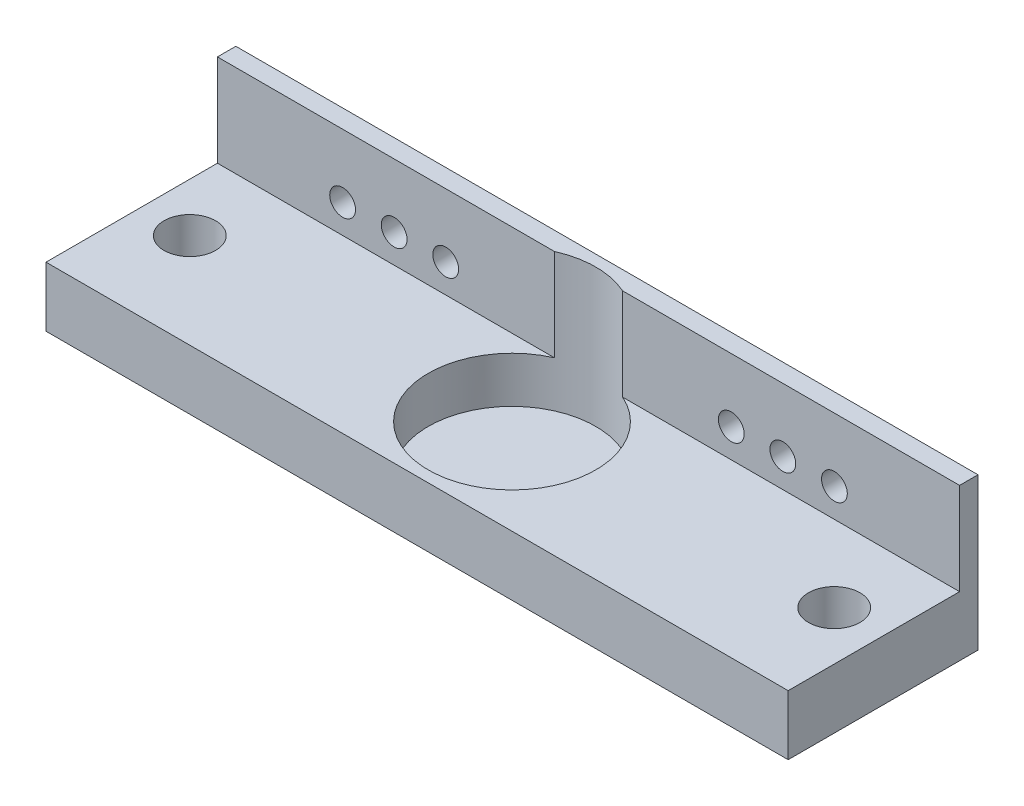
ISO-10303-21;
HEADER;
FILE_DESCRIPTION(('STEP AP214'),'2;1');
FILE_NAME('part.step','',(''),(''),'','','');
FILE_SCHEMA(('AUTOMOTIVE_DESIGN { 1 0 10303 214 1 1 1 1 }'));
ENDSEC;
DATA;
#1=APPLICATION_CONTEXT('core data for automotive mechanical design processes');
#2=APPLICATION_PROTOCOL_DEFINITION('international standard','automotive_design',2000,#1);
#3=PRODUCT_CONTEXT('',#1,'mechanical');
#4=PRODUCT('Part','Part','',(#3));
#5=PRODUCT_RELATED_PRODUCT_CATEGORY('part','',(#4));
#6=PRODUCT_DEFINITION_FORMATION('','',#4);
#7=PRODUCT_DEFINITION_CONTEXT('part definition',#1,'design');
#8=PRODUCT_DEFINITION('design','',#6,#7);
#9=PRODUCT_DEFINITION_SHAPE('','',#8);
#10=(LENGTH_UNIT() NAMED_UNIT(*) SI_UNIT(.MILLI.,.METRE.));
#11=(NAMED_UNIT(*) PLANE_ANGLE_UNIT() SI_UNIT($,.RADIAN.));
#12=(NAMED_UNIT(*) SI_UNIT($,.STERADIAN.) SOLID_ANGLE_UNIT());
#13=UNCERTAINTY_MEASURE_WITH_UNIT(LENGTH_MEASURE(1.E-05),#10,'distance_accuracy_value','');
#14=(GEOMETRIC_REPRESENTATION_CONTEXT(3) GLOBAL_UNCERTAINTY_ASSIGNED_CONTEXT((#13)) GLOBAL_UNIT_ASSIGNED_CONTEXT((#10,
#11,#12)) REPRESENTATION_CONTEXT('',''));
#15=CARTESIAN_POINT('',(0.,0.,0.));
#16=DIRECTION('',(0.,0.,1.));
#17=DIRECTION('',(1.,0.,0.));
#18=AXIS2_PLACEMENT_3D('',#15,#16,#17);
#19=CARTESIAN_POINT('',(-51.195,1.905,13.095));
#20=DIRECTION('',(1.,0.,0.));
#21=DIRECTION('',(0.,0.,-1.));
#22=AXIS2_PLACEMENT_3D('',#19,#20,#21);
#23=PLANE('',#22);
#24=DIRECTION('',(0.,0.,1.));
#25=VECTOR('',#24,1.);
#26=CARTESIAN_POINT('',(-51.195,0.,13.095));
#27=LINE('',#26,#25);
#28=CARTESIAN_POINT('',(-51.195,0.,-13.095));
#29=VERTEX_POINT('',#28);
#30=CARTESIAN_POINT('',(-51.195,0.,13.095));
#31=VERTEX_POINT('',#30);
#32=EDGE_CURVE('E165',#29,#31,#27,.T.);
#33=ORIENTED_EDGE('',*,*,#32,.T.);
#34=DIRECTION('',(0.,-1.,0.));
#35=VECTOR('',#34,1.);
#36=CARTESIAN_POINT('',(-51.195,1.905,13.095));
#37=LINE('',#36,#35);
#38=CARTESIAN_POINT('',(-51.195,8.255,13.095));
#39=VERTEX_POINT('',#38);
#40=EDGE_CURVE('E188',#39,#31,#37,.T.);
#41=ORIENTED_EDGE('',*,*,#40,.F.);
#42=DIRECTION('',(0.,0.,1.));
#43=VECTOR('',#42,1.);
#44=CARTESIAN_POINT('',(-51.195,8.255,0.));
#45=LINE('',#44,#43);
#46=CARTESIAN_POINT('',(-51.195,8.255,-10.555));
#47=VERTEX_POINT('',#46);
#48=EDGE_CURVE('E138',#47,#39,#45,.T.);
#49=ORIENTED_EDGE('',*,*,#48,.F.);
#50=DIRECTION('',(0.,-1.,0.));
#51=VECTOR('',#50,1.);
#52=CARTESIAN_POINT('',(-51.195,20.955,-10.555));
#53=LINE('',#52,#51);
#54=CARTESIAN_POINT('',(-51.195,20.955,-10.555));
#55=VERTEX_POINT('',#54);
#56=EDGE_CURVE('E116',#55,#47,#53,.T.);
#57=ORIENTED_EDGE('',*,*,#56,.F.);
#58=DIRECTION('',(0.,0.,1.));
#59=VECTOR('',#58,1.);
#60=CARTESIAN_POINT('',(-51.195,20.955,-13.095));
#61=LINE('',#60,#59);
#62=CARTESIAN_POINT('',(-51.195,20.955,-13.095));
#63=VERTEX_POINT('',#62);
#64=EDGE_CURVE('E123',#63,#55,#61,.T.);
#65=ORIENTED_EDGE('',*,*,#64,.F.);
#66=DIRECTION('',(0.,-1.,0.));
#67=VECTOR('',#66,1.);
#68=CARTESIAN_POINT('',(-51.195,1.905,-13.095));
#69=LINE('',#68,#67);
#70=EDGE_CURVE('E177',#63,#29,#69,.T.);
#71=ORIENTED_EDGE('',*,*,#70,.T.);
#72=EDGE_LOOP('',(#33,#41,#49,#57,#65,#71));
#73=FACE_BOUND('',#72,.T.);
#74=ADVANCED_FACE('F47',(#73),#23,.F.);
#75=CARTESIAN_POINT('',(51.195,1.905,13.095));
#76=DIRECTION('',(0.,0.,-1.));
#77=DIRECTION('',(-1.,0.,0.));
#78=AXIS2_PLACEMENT_3D('',#75,#76,#77);
#79=PLANE('',#78);
#80=DIRECTION('',(1.,0.,0.));
#81=VECTOR('',#80,1.);
#82=CARTESIAN_POINT('',(51.195,0.,13.095));
#83=LINE('',#82,#81);
#84=CARTESIAN_POINT('',(51.195,0.,13.095));
#85=VERTEX_POINT('',#84);
#86=EDGE_CURVE('E168',#31,#85,#83,.T.);
#87=ORIENTED_EDGE('',*,*,#86,.T.);
#88=DIRECTION('',(0.,-1.,0.));
#89=VECTOR('',#88,1.);
#90=CARTESIAN_POINT('',(51.195,1.905,13.095));
#91=LINE('',#90,#89);
#92=CARTESIAN_POINT('',(51.195,8.255,13.095));
#93=VERTEX_POINT('',#92);
#94=EDGE_CURVE('E184',#93,#85,#91,.T.);
#95=ORIENTED_EDGE('',*,*,#94,.F.);
#96=DIRECTION('',(1.,0.,0.));
#97=VECTOR('',#96,1.);
#98=CARTESIAN_POINT('',(0.,8.255,13.095));
#99=LINE('',#98,#97);
#100=EDGE_CURVE('E160',#39,#93,#99,.T.);
#101=ORIENTED_EDGE('',*,*,#100,.F.);
#102=ORIENTED_EDGE('',*,*,#40,.T.);
#103=EDGE_LOOP('',(#87,#95,#101,#102));
#104=FACE_BOUND('',#103,.T.);
#105=ADVANCED_FACE('F216',(#104),#79,.F.);
#106=CARTESIAN_POINT('',(51.195,1.905,13.095));
#107=DIRECTION('',(-1.,0.,0.));
#108=DIRECTION('',(0.,0.,1.));
#109=AXIS2_PLACEMENT_3D('',#106,#107,#108);
#110=PLANE('',#109);
#111=DIRECTION('',(0.,0.,-1.));
#112=VECTOR('',#111,1.);
#113=CARTESIAN_POINT('',(51.195,0.,13.095));
#114=LINE('',#113,#112);
#115=CARTESIAN_POINT('',(51.195,0.,-13.095));
#116=VERTEX_POINT('',#115);
#117=EDGE_CURVE('E171',#85,#116,#114,.T.);
#118=ORIENTED_EDGE('',*,*,#117,.T.);
#119=DIRECTION('',(0.,-1.,0.));
#120=VECTOR('',#119,1.);
#121=CARTESIAN_POINT('',(51.195,1.905,-13.095));
#122=LINE('',#121,#120);
#123=CARTESIAN_POINT('',(51.195,20.955,-13.095));
#124=VERTEX_POINT('',#123);
#125=EDGE_CURVE('E180',#124,#116,#122,.T.);
#126=ORIENTED_EDGE('',*,*,#125,.F.);
#127=DIRECTION('',(0.,0.,1.));
#128=VECTOR('',#127,1.);
#129=CARTESIAN_POINT('',(51.195,20.955,-13.095));
#130=LINE('',#129,#128);
#131=CARTESIAN_POINT('',(51.195,20.955,-10.555));
#132=VERTEX_POINT('',#131);
#133=EDGE_CURVE('E246',#124,#132,#130,.T.);
#134=ORIENTED_EDGE('',*,*,#133,.T.);
#135=DIRECTION('',(0.,-1.,0.));
#136=VECTOR('',#135,1.);
#137=CARTESIAN_POINT('',(51.195,20.955,-10.555));
#138=LINE('',#137,#136);
#139=CARTESIAN_POINT('',(51.195,8.255,-10.555));
#140=VERTEX_POINT('',#139);
#141=EDGE_CURVE('E254',#132,#140,#138,.T.);
#142=ORIENTED_EDGE('',*,*,#141,.T.);
#143=DIRECTION('',(0.,0.,-1.));
#144=VECTOR('',#143,1.);
#145=CARTESIAN_POINT('',(51.195,8.255,0.));
#146=LINE('',#145,#144);
#147=EDGE_CURVE('E62',#93,#140,#146,.T.);
#148=ORIENTED_EDGE('',*,*,#147,.F.);
#149=ORIENTED_EDGE('',*,*,#94,.T.);
#150=EDGE_LOOP('',(#118,#126,#134,#142,#148,#149));
#151=FACE_BOUND('',#150,.T.);
#152=ADVANCED_FACE('F220',(#151),#110,.F.);
#153=CARTESIAN_POINT('',(51.195,1.905,-13.095));
#154=DIRECTION('',(0.,0.,1.));
#155=DIRECTION('',(1.,0.,0.));
#156=AXIS2_PLACEMENT_3D('',#153,#154,#155);
#157=PLANE('',#156);
#158=CARTESIAN_POINT('',(-33.923,12.211,-13.095));
#159=DIRECTION('',(0.,0.,-1.));
#160=DIRECTION('',(-1.,0.,0.));
#161=AXIS2_PLACEMENT_3D('',#158,#159,#160);
#162=CIRCLE('',#161,1.778);
#163=CARTESIAN_POINT('',(-35.701,12.211,-13.095));
#164=VERTEX_POINT('',#163);
#165=EDGE_CURVE('E323',#164,#164,#162,.T.);
#166=ORIENTED_EDGE('',*,*,#165,.F.);
#167=EDGE_LOOP('',(#166));
#168=FACE_BOUND('',#167,.T.);
#169=CARTESIAN_POINT('',(19.699,12.211,-13.095));
#170=DIRECTION('',(0.,0.,-1.));
#171=DIRECTION('',(-1.,0.,0.));
#172=AXIS2_PLACEMENT_3D('',#169,#170,#171);
#173=CIRCLE('',#172,1.778);
#174=CARTESIAN_POINT('',(17.921,12.211,-13.095));
#175=VERTEX_POINT('',#174);
#176=EDGE_CURVE('E336',#175,#175,#173,.T.);
#177=ORIENTED_EDGE('',*,*,#176,.F.);
#178=EDGE_LOOP('',(#177));
#179=FACE_BOUND('',#178,.T.);
#180=CARTESIAN_POINT('',(26.811,12.211,-13.095));
#181=DIRECTION('',(0.,0.,-1.));
#182=DIRECTION('',(-1.,0.,0.));
#183=AXIS2_PLACEMENT_3D('',#180,#181,#182);
#184=CIRCLE('',#183,1.778);
#185=CARTESIAN_POINT('',(25.033,12.211,-13.095));
#186=VERTEX_POINT('',#185);
#187=EDGE_CURVE('E361',#186,#186,#184,.T.);
#188=ORIENTED_EDGE('',*,*,#187,.F.);
#189=EDGE_LOOP('',(#188));
#190=FACE_BOUND('',#189,.T.);
#191=CARTESIAN_POINT('',(33.923,12.211,-13.095));
#192=DIRECTION('',(0.,0.,-1.));
#193=DIRECTION('',(-1.,0.,0.));
#194=AXIS2_PLACEMENT_3D('',#191,#192,#193);
#195=CIRCLE('',#194,1.778);
#196=CARTESIAN_POINT('',(32.145,12.211,-13.095));
#197=VERTEX_POINT('',#196);
#198=EDGE_CURVE('E353',#197,#197,#195,.T.);
#199=ORIENTED_EDGE('',*,*,#198,.F.);
#200=EDGE_LOOP('',(#199));
#201=FACE_BOUND('',#200,.T.);
#202=CARTESIAN_POINT('',(-19.699,12.211,-13.095));
#203=DIRECTION('',(0.,0.,-1.));
#204=DIRECTION('',(-1.,0.,0.));
#205=AXIS2_PLACEMENT_3D('',#202,#203,#204);
#206=CIRCLE('',#205,1.778);
#207=CARTESIAN_POINT('',(-21.477,12.211,-13.095));
#208=VERTEX_POINT('',#207);
#209=EDGE_CURVE('E345',#208,#208,#206,.T.);
#210=ORIENTED_EDGE('',*,*,#209,.F.);
#211=EDGE_LOOP('',(#210));
#212=FACE_BOUND('',#211,.T.);
#213=CARTESIAN_POINT('',(-26.811,12.211,-13.095));
#214=DIRECTION('',(0.,0.,-1.));
#215=DIRECTION('',(-1.,0.,0.));
#216=AXIS2_PLACEMENT_3D('',#213,#214,#215);
#217=CIRCLE('',#216,1.778);
#218=CARTESIAN_POINT('',(-28.589,12.211,-13.095));
#219=VERTEX_POINT('',#218);
#220=EDGE_CURVE('E329',#219,#219,#217,.T.);
#221=ORIENTED_EDGE('',*,*,#220,.F.);
#222=EDGE_LOOP('',(#221));
#223=FACE_BOUND('',#222,.T.);
#224=DIRECTION('',(-1.,0.,0.));
#225=VECTOR('',#224,1.);
#226=CARTESIAN_POINT('',(51.195,0.,-13.095));
#227=LINE('',#226,#225);
#228=EDGE_CURVE('E174',#116,#29,#227,.T.);
#229=ORIENTED_EDGE('',*,*,#228,.T.);
#230=ORIENTED_EDGE('',*,*,#70,.F.);
#231=DIRECTION('',(1.,0.,0.));
#232=VECTOR('',#231,1.);
#233=CARTESIAN_POINT('',(-51.195,20.955,-13.095));
#234=LINE('',#233,#232);
#235=EDGE_CURVE('E130',#63,#124,#234,.T.);
#236=ORIENTED_EDGE('',*,*,#235,.T.);
#237=ORIENTED_EDGE('',*,*,#125,.T.);
#238=EDGE_LOOP('',(#229,#230,#236,#237));
#239=FACE_BOUND('',#238,.T.);
#240=ADVANCED_FACE('F225',(#168,#179,#190,#201,#212,#223,#239),#157,.F.);
#241=CARTESIAN_POINT('',(0.,0.,0.));
#242=DIRECTION('',(0.,1.,0.));
#243=DIRECTION('',(0.,0.,1.));
#244=AXIS2_PLACEMENT_3D('',#241,#242,#243);
#245=PLANE('',#244);
#246=ORIENTED_EDGE('',*,*,#32,.F.);
#247=ORIENTED_EDGE('',*,*,#228,.F.);
#248=ORIENTED_EDGE('',*,*,#117,.F.);
#249=ORIENTED_EDGE('',*,*,#86,.F.);
#250=EDGE_LOOP('',(#246,#247,#248,#249));
#251=FACE_BOUND('',#250,.T.);
#252=ADVANCED_FACE('F230',(#251),#245,.F.);
#253=CARTESIAN_POINT('',(0.,8.255,0.));
#254=DIRECTION('',(0.,-1.,0.));
#255=DIRECTION('',(0.,0.,-1.));
#256=AXIS2_PLACEMENT_3D('',#253,#254,#255);
#257=CYLINDRICAL_SURFACE('',#256,11.557);
#258=CARTESIAN_POINT('',(0.,8.255,0.));
#259=DIRECTION('',(0.,1.,0.));
#260=DIRECTION('',(0.,0.,1.));
#261=AXIS2_PLACEMENT_3D('',#258,#259,#260);
#262=CIRCLE('',#261,11.557);
#263=CARTESIAN_POINT('',(-4.70703983412087,8.255,-10.555));
#264=VERTEX_POINT('',#263);
#265=CARTESIAN_POINT('',(4.70703983412087,8.255,-10.555));
#266=VERTEX_POINT('',#265);
#267=EDGE_CURVE('E154',#264,#266,#262,.T.);
#268=ORIENTED_EDGE('',*,*,#267,.T.);
#269=DIRECTION('',(0.,-1.,0.));
#270=VECTOR('',#269,1.);
#271=CARTESIAN_POINT('',(4.70703983412087,20.955,-10.555));
#272=LINE('',#271,#270);
#273=CARTESIAN_POINT('',(4.70703983412087,20.955,-10.555));
#274=VERTEX_POINT('',#273);
#275=EDGE_CURVE('E147',#274,#266,#272,.T.);
#276=ORIENTED_EDGE('',*,*,#275,.F.);
#277=CARTESIAN_POINT('',(0.,20.955,0.));
#278=DIRECTION('',(0.,-1.,0.));
#279=DIRECTION('',(0.,0.,-1.));
#280=AXIS2_PLACEMENT_3D('',#277,#278,#279);
#281=CIRCLE('',#280,11.5570000000001);
#282=CARTESIAN_POINT('',(-4.70703983412087,20.955,-10.555));
#283=VERTEX_POINT('',#282);
#284=EDGE_CURVE('E122',#283,#274,#281,.T.);
#285=ORIENTED_EDGE('',*,*,#284,.F.);
#286=DIRECTION('',(0.,-1.,0.));
#287=VECTOR('',#286,1.);
#288=CARTESIAN_POINT('',(-4.70703983412087,20.955,-10.555));
#289=LINE('',#288,#287);
#290=EDGE_CURVE('E118',#283,#264,#289,.T.);
#291=ORIENTED_EDGE('',*,*,#290,.T.);
#292=EDGE_LOOP('',(#268,#276,#285,#291));
#293=FACE_BOUND('',#292,.T.);
#294=CARTESIAN_POINT('',(0.,1.905,0.));
#295=DIRECTION('',(0.,1.,0.));
#296=DIRECTION('',(0.,0.,1.));
#297=AXIS2_PLACEMENT_3D('',#294,#295,#296);
#298=CIRCLE('',#297,11.557);
#299=CARTESIAN_POINT('',(0.,1.905,11.557));
#300=VERTEX_POINT('',#299);
#301=EDGE_CURVE('E12',#300,#300,#298,.F.);
#302=ORIENTED_EDGE('',*,*,#301,.T.);
#303=EDGE_LOOP('',(#302));
#304=FACE_BOUND('',#303,.T.);
#305=ADVANCED_FACE('F233',(#293,#304),#257,.F.);
#306=CARTESIAN_POINT('',(-44.45,8.255,0.));
#307=DIRECTION('',(0.,-1.,0.));
#308=DIRECTION('',(0.,0.,-1.));
#309=AXIS2_PLACEMENT_3D('',#306,#307,#308);
#310=CYLINDRICAL_SURFACE('',#309,3.55600000000001);
#311=CARTESIAN_POINT('',(-44.45,8.255,0.));
#312=DIRECTION('',(0.,1.,0.));
#313=DIRECTION('',(0.,0.,1.));
#314=AXIS2_PLACEMENT_3D('',#311,#312,#313);
#315=CIRCLE('',#314,3.55600000000001);
#316=CARTESIAN_POINT('',(-44.45,8.255,3.55600000000001));
#317=VERTEX_POINT('',#316);
#318=EDGE_CURVE('E145',#317,#317,#315,.T.);
#319=ORIENTED_EDGE('',*,*,#318,.T.);
#320=EDGE_LOOP('',(#319));
#321=FACE_BOUND('',#320,.T.);
#322=CARTESIAN_POINT('',(-44.45,1.905,0.));
#323=DIRECTION('',(0.,1.,0.));
#324=DIRECTION('',(0.,0.,1.));
#325=AXIS2_PLACEMENT_3D('',#322,#323,#324);
#326=CIRCLE('',#325,3.55600000000001);
#327=CARTESIAN_POINT('',(-44.45,1.905,3.55600000000001));
#328=VERTEX_POINT('',#327);
#329=EDGE_CURVE('E55',#328,#328,#326,.F.);
#330=ORIENTED_EDGE('',*,*,#329,.T.);
#331=EDGE_LOOP('',(#330));
#332=FACE_BOUND('',#331,.T.);
#333=ADVANCED_FACE('F199',(#321,#332),#310,.F.);
#334=CARTESIAN_POINT('',(44.45,8.255,0.));
#335=DIRECTION('',(0.,-1.,0.));
#336=DIRECTION('',(0.,0.,-1.));
#337=AXIS2_PLACEMENT_3D('',#334,#335,#336);
#338=CYLINDRICAL_SURFACE('',#337,3.55600000000001);
#339=CARTESIAN_POINT('',(44.45,8.255,0.));
#340=DIRECTION('',(0.,1.,0.));
#341=DIRECTION('',(0.,0.,1.));
#342=AXIS2_PLACEMENT_3D('',#339,#340,#341);
#343=CIRCLE('',#342,3.55600000000001);
#344=CARTESIAN_POINT('',(44.45,8.255,3.55600000000001));
#345=VERTEX_POINT('',#344);
#346=EDGE_CURVE('E140',#345,#345,#343,.T.);
#347=ORIENTED_EDGE('',*,*,#346,.T.);
#348=EDGE_LOOP('',(#347));
#349=FACE_BOUND('',#348,.T.);
#350=CARTESIAN_POINT('',(44.45,1.905,0.));
#351=DIRECTION('',(0.,1.,0.));
#352=DIRECTION('',(0.,0.,1.));
#353=AXIS2_PLACEMENT_3D('',#350,#351,#352);
#354=CIRCLE('',#353,3.55600000000001);
#355=CARTESIAN_POINT('',(44.45,1.905,3.55600000000001));
#356=VERTEX_POINT('',#355);
#357=EDGE_CURVE('E192',#356,#356,#354,.F.);
#358=ORIENTED_EDGE('',*,*,#357,.T.);
#359=EDGE_LOOP('',(#358));
#360=FACE_BOUND('',#359,.T.);
#361=ADVANCED_FACE('F274',(#349,#360),#338,.F.);
#362=CARTESIAN_POINT('',(0.,8.255,0.));
#363=DIRECTION('',(0.,1.,0.));
#364=DIRECTION('',(0.,0.,1.));
#365=AXIS2_PLACEMENT_3D('',#362,#363,#364);
#366=PLANE('',#365);
#367=DIRECTION('',(1.,0.,0.));
#368=VECTOR('',#367,1.);
#369=CARTESIAN_POINT('',(4.70703983412087,8.255,-10.555));
#370=LINE('',#369,#368);
#371=EDGE_CURVE('E134',#266,#140,#370,.T.);
#372=ORIENTED_EDGE('',*,*,#371,.F.);
#373=ORIENTED_EDGE('',*,*,#267,.F.);
#374=DIRECTION('',(1.,0.,0.));
#375=VECTOR('',#374,1.);
#376=CARTESIAN_POINT('',(-51.195,8.255,-10.555));
#377=LINE('',#376,#375);
#378=EDGE_CURVE('E69',#47,#264,#377,.T.);
#379=ORIENTED_EDGE('',*,*,#378,.F.);
#380=ORIENTED_EDGE('',*,*,#48,.T.);
#381=ORIENTED_EDGE('',*,*,#100,.T.);
#382=ORIENTED_EDGE('',*,*,#147,.T.);
#383=EDGE_LOOP('',(#372,#373,#379,#380,#381,#382));
#384=FACE_BOUND('',#383,.T.);
#385=ORIENTED_EDGE('',*,*,#346,.F.);
#386=EDGE_LOOP('',(#385));
#387=FACE_BOUND('',#386,.T.);
#388=ORIENTED_EDGE('',*,*,#318,.F.);
#389=EDGE_LOOP('',(#388));
#390=FACE_BOUND('',#389,.T.);
#391=ADVANCED_FACE('F211',(#384,#387,#390),#366,.T.);
#392=CARTESIAN_POINT('',(0.,1.905,0.));
#393=DIRECTION('',(0.,1.,0.));
#394=DIRECTION('',(0.,0.,1.));
#395=AXIS2_PLACEMENT_3D('',#392,#393,#394);
#396=PLANE('',#395);
#397=ORIENTED_EDGE('',*,*,#357,.F.);
#398=EDGE_LOOP('',(#397));
#399=FACE_BOUND('',#398,.T.);
#400=ADVANCED_FACE('F204',(#399),#396,.T.);
#401=ORIENTED_EDGE('',*,*,#329,.F.);
#402=EDGE_LOOP('',(#401));
#403=FACE_BOUND('',#402,.T.);
#404=ADVANCED_FACE('F201',(#403),#396,.T.);
#405=ORIENTED_EDGE('',*,*,#301,.F.);
#406=EDGE_LOOP('',(#405));
#407=FACE_BOUND('',#406,.T.);
#408=ADVANCED_FACE('F203',(#407),#396,.T.);
#409=CARTESIAN_POINT('',(-51.195,20.955,-10.555));
#410=DIRECTION('',(0.,0.,-1.));
#411=DIRECTION('',(-1.,0.,0.));
#412=AXIS2_PLACEMENT_3D('',#409,#410,#411);
#413=PLANE('',#412);
#414=CARTESIAN_POINT('',(-33.923,12.211,-10.555));
#415=DIRECTION('',(0.,0.,-1.));
#416=DIRECTION('',(-1.,0.,0.));
#417=AXIS2_PLACEMENT_3D('',#414,#415,#416);
#418=CIRCLE('',#417,1.778);
#419=CARTESIAN_POINT('',(-35.701,12.211,-10.555));
#420=VERTEX_POINT('',#419);
#421=EDGE_CURVE('E261',#420,#420,#418,.F.);
#422=ORIENTED_EDGE('',*,*,#421,.F.);
#423=EDGE_LOOP('',(#422));
#424=FACE_BOUND('',#423,.T.);
#425=CARTESIAN_POINT('',(-19.699,12.211,-10.555));
#426=DIRECTION('',(0.,0.,-1.));
#427=DIRECTION('',(-1.,0.,0.));
#428=AXIS2_PLACEMENT_3D('',#425,#426,#427);
#429=CIRCLE('',#428,1.778);
#430=CARTESIAN_POINT('',(-21.477,12.211,-10.555));
#431=VERTEX_POINT('',#430);
#432=EDGE_CURVE('E349',#431,#431,#429,.F.);
#433=ORIENTED_EDGE('',*,*,#432,.F.);
#434=EDGE_LOOP('',(#433));
#435=FACE_BOUND('',#434,.T.);
#436=CARTESIAN_POINT('',(-26.811,12.211,-10.555));
#437=DIRECTION('',(0.,0.,-1.));
#438=DIRECTION('',(-1.,0.,0.));
#439=AXIS2_PLACEMENT_3D('',#436,#437,#438);
#440=CIRCLE('',#439,1.778);
#441=CARTESIAN_POINT('',(-28.589,12.211,-10.555));
#442=VERTEX_POINT('',#441);
#443=EDGE_CURVE('E341',#442,#442,#440,.F.);
#444=ORIENTED_EDGE('',*,*,#443,.F.);
#445=EDGE_LOOP('',(#444));
#446=FACE_BOUND('',#445,.T.);
#447=ORIENTED_EDGE('',*,*,#378,.T.);
#448=ORIENTED_EDGE('',*,*,#290,.F.);
#449=DIRECTION('',(1.,0.,0.));
#450=VECTOR('',#449,1.);
#451=CARTESIAN_POINT('',(-51.195,20.955,-10.555));
#452=LINE('',#451,#450);
#453=EDGE_CURVE('E112',#55,#283,#452,.T.);
#454=ORIENTED_EDGE('',*,*,#453,.F.);
#455=ORIENTED_EDGE('',*,*,#56,.T.);
#456=EDGE_LOOP('',(#447,#448,#454,#455));
#457=FACE_BOUND('',#456,.T.);
#458=ADVANCED_FACE('F114',(#424,#435,#446,#457),#413,.F.);
#459=CARTESIAN_POINT('',(4.70703983412087,20.955,-10.555));
#460=DIRECTION('',(0.,0.,-1.));
#461=DIRECTION('',(-1.,0.,0.));
#462=AXIS2_PLACEMENT_3D('',#459,#460,#461);
#463=PLANE('',#462);
#464=CARTESIAN_POINT('',(19.699,12.211,-10.555));
#465=DIRECTION('',(0.,0.,-1.));
#466=DIRECTION('',(-1.,0.,0.));
#467=AXIS2_PLACEMENT_3D('',#464,#465,#466);
#468=CIRCLE('',#467,1.778);
#469=CARTESIAN_POINT('',(17.921,12.211,-10.555));
#470=VERTEX_POINT('',#469);
#471=EDGE_CURVE('E332',#470,#470,#468,.F.);
#472=ORIENTED_EDGE('',*,*,#471,.F.);
#473=EDGE_LOOP('',(#472));
#474=FACE_BOUND('',#473,.T.);
#475=CARTESIAN_POINT('',(26.811,12.211,-10.555));
#476=DIRECTION('',(0.,0.,-1.));
#477=DIRECTION('',(-1.,0.,0.));
#478=AXIS2_PLACEMENT_3D('',#475,#476,#477);
#479=CIRCLE('',#478,1.778);
#480=CARTESIAN_POINT('',(25.033,12.211,-10.555));
#481=VERTEX_POINT('',#480);
#482=EDGE_CURVE('E340',#481,#481,#479,.F.);
#483=ORIENTED_EDGE('',*,*,#482,.F.);
#484=EDGE_LOOP('',(#483));
#485=FACE_BOUND('',#484,.T.);
#486=CARTESIAN_POINT('',(33.923,12.211,-10.555));
#487=DIRECTION('',(0.,0.,-1.));
#488=DIRECTION('',(-1.,0.,0.));
#489=AXIS2_PLACEMENT_3D('',#486,#487,#488);
#490=CIRCLE('',#489,1.778);
#491=CARTESIAN_POINT('',(32.145,12.211,-10.555));
#492=VERTEX_POINT('',#491);
#493=EDGE_CURVE('E357',#492,#492,#490,.F.);
#494=ORIENTED_EDGE('',*,*,#493,.F.);
#495=EDGE_LOOP('',(#494));
#496=FACE_BOUND('',#495,.T.);
#497=ORIENTED_EDGE('',*,*,#371,.T.);
#498=ORIENTED_EDGE('',*,*,#141,.F.);
#499=DIRECTION('',(1.,0.,0.));
#500=VECTOR('',#499,1.);
#501=CARTESIAN_POINT('',(4.70703983412087,20.955,-10.555));
#502=LINE('',#501,#500);
#503=EDGE_CURVE('E248',#274,#132,#502,.T.);
#504=ORIENTED_EDGE('',*,*,#503,.F.);
#505=ORIENTED_EDGE('',*,*,#275,.T.);
#506=EDGE_LOOP('',(#497,#498,#504,#505));
#507=FACE_BOUND('',#506,.T.);
#508=ADVANCED_FACE('F270',(#474,#485,#496,#507),#463,.F.);
#509=CARTESIAN_POINT('',(0.,20.955,0.));
#510=DIRECTION('',(0.,-1.,0.));
#511=DIRECTION('',(0.,0.,-1.));
#512=AXIS2_PLACEMENT_3D('',#509,#510,#511);
#513=PLANE('',#512);
#514=ORIENTED_EDGE('',*,*,#64,.T.);
#515=ORIENTED_EDGE('',*,*,#453,.T.);
#516=ORIENTED_EDGE('',*,*,#284,.T.);
#517=ORIENTED_EDGE('',*,*,#503,.T.);
#518=ORIENTED_EDGE('',*,*,#133,.F.);
#519=ORIENTED_EDGE('',*,*,#235,.F.);
#520=EDGE_LOOP('',(#514,#515,#516,#517,#518,#519));
#521=FACE_BOUND('',#520,.T.);
#522=ADVANCED_FACE('F127',(#521),#513,.F.);
#523=CARTESIAN_POINT('',(33.923,12.211,13.096));
#524=DIRECTION('',(0.,0.,-1.));
#525=DIRECTION('',(-1.,0.,0.));
#526=AXIS2_PLACEMENT_3D('',#523,#524,#525);
#527=CYLINDRICAL_SURFACE('',#526,1.778);
#528=ORIENTED_EDGE('',*,*,#198,.T.);
#529=EDGE_LOOP('',(#528));
#530=FACE_BOUND('',#529,.T.);
#531=ORIENTED_EDGE('',*,*,#493,.T.);
#532=EDGE_LOOP('',(#531));
#533=FACE_BOUND('',#532,.T.);
#534=ADVANCED_FACE('F295',(#530,#533),#527,.F.);
#535=CARTESIAN_POINT('',(26.811,12.211,13.096));
#536=DIRECTION('',(0.,0.,-1.));
#537=DIRECTION('',(-1.,0.,0.));
#538=AXIS2_PLACEMENT_3D('',#535,#536,#537);
#539=CYLINDRICAL_SURFACE('',#538,1.778);
#540=ORIENTED_EDGE('',*,*,#187,.T.);
#541=EDGE_LOOP('',(#540));
#542=FACE_BOUND('',#541,.T.);
#543=ORIENTED_EDGE('',*,*,#482,.T.);
#544=EDGE_LOOP('',(#543));
#545=FACE_BOUND('',#544,.T.);
#546=ADVANCED_FACE('F296',(#542,#545),#539,.F.);
#547=CARTESIAN_POINT('',(19.699,12.211,13.096));
#548=DIRECTION('',(0.,0.,-1.));
#549=DIRECTION('',(-1.,0.,0.));
#550=AXIS2_PLACEMENT_3D('',#547,#548,#549);
#551=CYLINDRICAL_SURFACE('',#550,1.778);
#552=ORIENTED_EDGE('',*,*,#176,.T.);
#553=EDGE_LOOP('',(#552));
#554=FACE_BOUND('',#553,.T.);
#555=ORIENTED_EDGE('',*,*,#471,.T.);
#556=EDGE_LOOP('',(#555));
#557=FACE_BOUND('',#556,.T.);
#558=ADVANCED_FACE('F299',(#554,#557),#551,.F.);
#559=CARTESIAN_POINT('',(-26.811,12.211,13.096));
#560=DIRECTION('',(0.,0.,-1.));
#561=DIRECTION('',(-1.,0.,0.));
#562=AXIS2_PLACEMENT_3D('',#559,#560,#561);
#563=CYLINDRICAL_SURFACE('',#562,1.778);
#564=ORIENTED_EDGE('',*,*,#220,.T.);
#565=EDGE_LOOP('',(#564));
#566=FACE_BOUND('',#565,.T.);
#567=ORIENTED_EDGE('',*,*,#443,.T.);
#568=EDGE_LOOP('',(#567));
#569=FACE_BOUND('',#568,.T.);
#570=ADVANCED_FACE('F308',(#566,#569),#563,.F.);
#571=CARTESIAN_POINT('',(-19.699,12.211,13.096));
#572=DIRECTION('',(0.,0.,-1.));
#573=DIRECTION('',(-1.,0.,0.));
#574=AXIS2_PLACEMENT_3D('',#571,#572,#573);
#575=CYLINDRICAL_SURFACE('',#574,1.778);
#576=ORIENTED_EDGE('',*,*,#209,.T.);
#577=EDGE_LOOP('',(#576));
#578=FACE_BOUND('',#577,.T.);
#579=ORIENTED_EDGE('',*,*,#432,.T.);
#580=EDGE_LOOP('',(#579));
#581=FACE_BOUND('',#580,.T.);
#582=ADVANCED_FACE('F304',(#578,#581),#575,.F.);
#583=CARTESIAN_POINT('',(-33.923,12.211,13.096));
#584=DIRECTION('',(0.,0.,-1.));
#585=DIRECTION('',(-1.,0.,0.));
#586=AXIS2_PLACEMENT_3D('',#583,#584,#585);
#587=CYLINDRICAL_SURFACE('',#586,1.778);
#588=ORIENTED_EDGE('',*,*,#165,.T.);
#589=EDGE_LOOP('',(#588));
#590=FACE_BOUND('',#589,.T.);
#591=ORIENTED_EDGE('',*,*,#421,.T.);
#592=EDGE_LOOP('',(#591));
#593=FACE_BOUND('',#592,.T.);
#594=ADVANCED_FACE('F307',(#590,#593),#587,.F.);
#595=CLOSED_SHELL('',(#74,#105,#152,#240,#252,#305,#333,#361,#391,#400,#404,#408,#458,#508,#522,
#534,#546,#558,#570,#582,#594));
#596=MANIFOLD_SOLID_BREP('B2',#595);
#597=ADVANCED_BREP_SHAPE_REPRESENTATION('',(#18,#596),#14);
#598=SHAPE_DEFINITION_REPRESENTATION(#9,#597);
ENDSEC;
END-ISO-10303-21;
